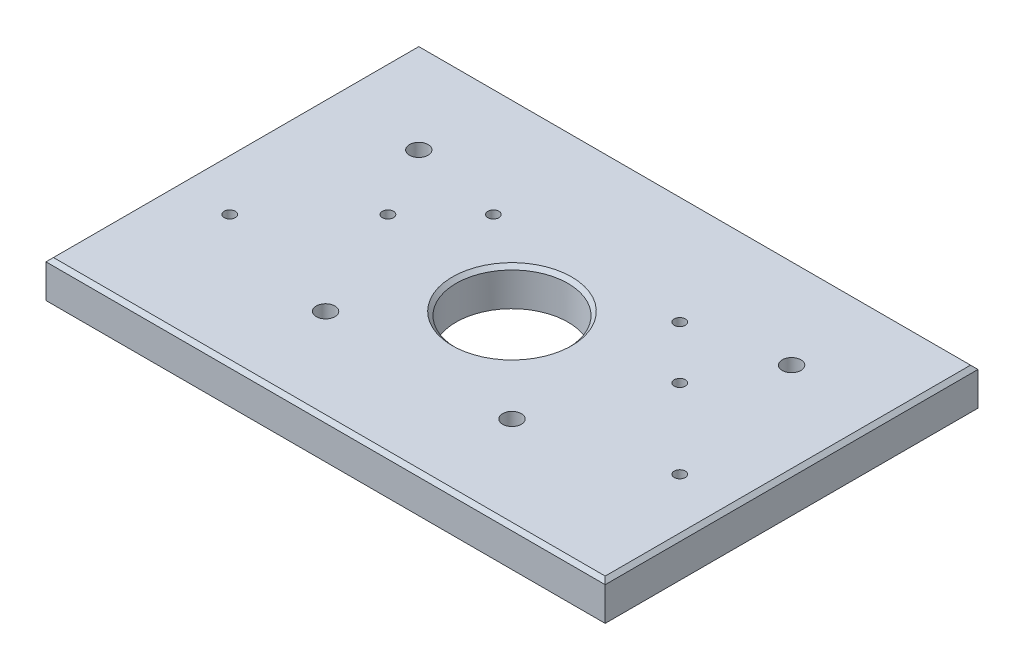
ISO-10303-21;
HEADER;
FILE_DESCRIPTION(('STEP AP214'),'2;1');
FILE_NAME('part.step','',(''),(''),'','','');
FILE_SCHEMA(('AUTOMOTIVE_DESIGN { 1 0 10303 214 1 1 1 1 }'));
ENDSEC;
DATA;
#1=APPLICATION_CONTEXT('core data for automotive mechanical design processes');
#2=APPLICATION_PROTOCOL_DEFINITION('international standard','automotive_design',2000,#1);
#3=PRODUCT_CONTEXT('',#1,'mechanical');
#4=PRODUCT('Part','Part','',(#3));
#5=PRODUCT_RELATED_PRODUCT_CATEGORY('part','',(#4));
#6=PRODUCT_DEFINITION_FORMATION('','',#4);
#7=PRODUCT_DEFINITION_CONTEXT('part definition',#1,'design');
#8=PRODUCT_DEFINITION('design','',#6,#7);
#9=PRODUCT_DEFINITION_SHAPE('','',#8);
#10=(LENGTH_UNIT() NAMED_UNIT(*) SI_UNIT(.MILLI.,.METRE.));
#11=(NAMED_UNIT(*) PLANE_ANGLE_UNIT() SI_UNIT($,.RADIAN.));
#12=(NAMED_UNIT(*) SI_UNIT($,.STERADIAN.) SOLID_ANGLE_UNIT());
#13=UNCERTAINTY_MEASURE_WITH_UNIT(LENGTH_MEASURE(1.E-05),#10,'distance_accuracy_value','');
#14=(GEOMETRIC_REPRESENTATION_CONTEXT(3) GLOBAL_UNCERTAINTY_ASSIGNED_CONTEXT((#13)) GLOBAL_UNIT_ASSIGNED_CONTEXT((#10,
#11,#12)) REPRESENTATION_CONTEXT('',''));
#15=CARTESIAN_POINT('',(0.,0.,0.));
#16=DIRECTION('',(0.,0.,1.));
#17=DIRECTION('',(1.,0.,0.));
#18=AXIS2_PLACEMENT_3D('',#15,#16,#17);
#19=CARTESIAN_POINT('',(0.,10.,0.));
#20=DIRECTION('',(0.,-1.,0.));
#21=DIRECTION('',(0.,0.,-1.));
#22=AXIS2_PLACEMENT_3D('',#19,#20,#21);
#23=PLANE('',#22);
#24=CARTESIAN_POINT('',(75.,10.,-50.));
#25=DIRECTION('',(0.,-1.,0.));
#26=DIRECTION('',(0.,0.,-1.));
#27=AXIS2_PLACEMENT_3D('',#24,#25,#26);
#28=CIRCLE('',#27,16.);
#29=CARTESIAN_POINT('',(75.,10.,-66.));
#30=VERTEX_POINT('',#29);
#31=EDGE_CURVE('E197',#30,#30,#28,.T.);
#32=ORIENTED_EDGE('',*,*,#31,.T.);
#33=EDGE_LOOP('',(#32));
#34=FACE_BOUND('',#33,.T.);
#35=DIRECTION('',(1.,0.,0.));
#36=VECTOR('',#35,1.);
#37=CARTESIAN_POINT('',(0.,10.,-1.));
#38=LINE('',#37,#36);
#39=CARTESIAN_POINT('',(1.,10.,-1.));
#40=VERTEX_POINT('',#39);
#41=CARTESIAN_POINT('',(149.,10.,-1.));
#42=VERTEX_POINT('',#41);
#43=EDGE_CURVE('E140',#40,#42,#38,.T.);
#44=ORIENTED_EDGE('',*,*,#43,.T.);
#45=DIRECTION('',(0.,0.,-1.));
#46=VECTOR('',#45,1.);
#47=CARTESIAN_POINT('',(149.,10.,0.));
#48=LINE('',#47,#46);
#49=CARTESIAN_POINT('',(149.,10.,-99.));
#50=VERTEX_POINT('',#49);
#51=EDGE_CURVE('E194',#42,#50,#48,.T.);
#52=ORIENTED_EDGE('',*,*,#51,.T.);
#53=DIRECTION('',(-1.,0.,0.));
#54=VECTOR('',#53,1.);
#55=CARTESIAN_POINT('',(0.,10.,-99.));
#56=LINE('',#55,#54);
#57=CARTESIAN_POINT('',(1.,10.,-99.));
#58=VERTEX_POINT('',#57);
#59=EDGE_CURVE('E147',#50,#58,#56,.T.);
#60=ORIENTED_EDGE('',*,*,#59,.T.);
#61=DIRECTION('',(0.,0.,1.));
#62=VECTOR('',#61,1.);
#63=CARTESIAN_POINT('',(1.,10.,0.));
#64=LINE('',#63,#62);
#65=EDGE_CURVE('E144',#58,#40,#64,.T.);
#66=ORIENTED_EDGE('',*,*,#65,.T.);
#67=EDGE_LOOP('',(#44,#52,#60,#66));
#68=FACE_BOUND('',#67,.T.);
#69=CARTESIAN_POINT('',(35.857864376269,10.,-55.8578643762691));
#70=DIRECTION('',(0.,1.,0.));
#71=DIRECTION('',(0.,0.,1.));
#72=AXIS2_PLACEMENT_3D('',#69,#70,#71);
#73=CIRCLE('',#72,1.50000000000001);
#74=CARTESIAN_POINT('',(35.857864376269,10.,-54.3578643762691));
#75=VERTEX_POINT('',#74);
#76=EDGE_CURVE('E508',#75,#75,#73,.T.);
#77=ORIENTED_EDGE('',*,*,#76,.F.);
#78=EDGE_LOOP('',(#77));
#79=FACE_BOUND('',#78,.T.);
#80=CARTESIAN_POINT('',(14.6446609406726,10.,-34.6446609406727));
#81=DIRECTION('',(0.,1.,0.));
#82=DIRECTION('',(0.,0.,1.));
#83=AXIS2_PLACEMENT_3D('',#80,#81,#82);
#84=CIRCLE('',#83,1.5);
#85=CARTESIAN_POINT('',(14.6446609406726,10.,-33.1446609406727));
#86=VERTEX_POINT('',#85);
#87=EDGE_CURVE('E518',#86,#86,#84,.T.);
#88=ORIENTED_EDGE('',*,*,#87,.F.);
#89=EDGE_LOOP('',(#88));
#90=FACE_BOUND('',#89,.T.);
#91=CARTESIAN_POINT('',(50.,10.,-25.));
#92=DIRECTION('',(0.,1.,0.));
#93=DIRECTION('',(0.,0.,1.));
#94=AXIS2_PLACEMENT_3D('',#91,#92,#93);
#95=CIRCLE('',#94,2.5);
#96=CARTESIAN_POINT('',(50.,10.,-22.5));
#97=VERTEX_POINT('',#96);
#98=EDGE_CURVE('E524',#97,#97,#95,.T.);
#99=ORIENTED_EDGE('',*,*,#98,.F.);
#100=EDGE_LOOP('',(#99));
#101=FACE_BOUND('',#100,.T.);
#102=CARTESIAN_POINT('',(50.,10.,-70.));
#103=DIRECTION('',(0.,1.,0.));
#104=DIRECTION('',(0.,0.,1.));
#105=AXIS2_PLACEMENT_3D('',#102,#103,#104);
#106=CIRCLE('',#105,1.5);
#107=CARTESIAN_POINT('',(50.,10.,-68.5));
#108=VERTEX_POINT('',#107);
#109=EDGE_CURVE('E509',#108,#108,#106,.T.);
#110=ORIENTED_EDGE('',*,*,#109,.F.);
#111=EDGE_LOOP('',(#110));
#112=FACE_BOUND('',#111,.T.);
#113=CARTESIAN_POINT('',(25.,10.,-75.));
#114=DIRECTION('',(0.,1.,0.));
#115=DIRECTION('',(0.,0.,1.));
#116=AXIS2_PLACEMENT_3D('',#113,#114,#115);
#117=CIRCLE('',#116,2.5);
#118=CARTESIAN_POINT('',(25.,10.,-72.5));
#119=VERTEX_POINT('',#118);
#120=EDGE_CURVE('E173',#119,#119,#117,.T.);
#121=ORIENTED_EDGE('',*,*,#120,.F.);
#122=EDGE_LOOP('',(#121));
#123=FACE_BOUND('',#122,.T.);
#124=CARTESIAN_POINT('',(100.,10.,-70.));
#125=DIRECTION('',(0.,-1.,0.));
#126=DIRECTION('',(0.,0.,-1.));
#127=AXIS2_PLACEMENT_3D('',#124,#125,#126);
#128=CIRCLE('',#127,1.5);
#129=CARTESIAN_POINT('',(100.,10.,-71.5));
#130=VERTEX_POINT('',#129);
#131=EDGE_CURVE('E121',#130,#130,#128,.T.);
#132=ORIENTED_EDGE('',*,*,#131,.T.);
#133=EDGE_LOOP('',(#132));
#134=FACE_BOUND('',#133,.T.);
#135=CARTESIAN_POINT('',(125.,10.,-75.));
#136=DIRECTION('',(0.,-1.,0.));
#137=DIRECTION('',(0.,0.,-1.));
#138=AXIS2_PLACEMENT_3D('',#135,#136,#137);
#139=CIRCLE('',#138,2.5);
#140=CARTESIAN_POINT('',(125.,10.,-77.5));
#141=VERTEX_POINT('',#140);
#142=EDGE_CURVE('E473',#141,#141,#139,.T.);
#143=ORIENTED_EDGE('',*,*,#142,.T.);
#144=EDGE_LOOP('',(#143));
#145=FACE_BOUND('',#144,.T.);
#146=CARTESIAN_POINT('',(114.142135623731,10.,-55.8578643762691));
#147=DIRECTION('',(0.,-1.,0.));
#148=DIRECTION('',(0.,0.,-1.));
#149=AXIS2_PLACEMENT_3D('',#146,#147,#148);
#150=CIRCLE('',#149,1.5);
#151=CARTESIAN_POINT('',(114.142135623731,10.,-57.3578643762691));
#152=VERTEX_POINT('',#151);
#153=EDGE_CURVE('E477',#152,#152,#150,.T.);
#154=ORIENTED_EDGE('',*,*,#153,.T.);
#155=EDGE_LOOP('',(#154));
#156=FACE_BOUND('',#155,.T.);
#157=CARTESIAN_POINT('',(135.355339059327,10.,-34.6446609406727));
#158=DIRECTION('',(0.,-1.,0.));
#159=DIRECTION('',(0.,0.,-1.));
#160=AXIS2_PLACEMENT_3D('',#157,#158,#159);
#161=CIRCLE('',#160,1.5);
#162=CARTESIAN_POINT('',(135.355339059327,10.,-36.1446609406727));
#163=VERTEX_POINT('',#162);
#164=EDGE_CURVE('E481',#163,#163,#161,.T.);
#165=ORIENTED_EDGE('',*,*,#164,.T.);
#166=EDGE_LOOP('',(#165));
#167=FACE_BOUND('',#166,.T.);
#168=CARTESIAN_POINT('',(100.,10.,-25.));
#169=DIRECTION('',(0.,-1.,0.));
#170=DIRECTION('',(0.,0.,-1.));
#171=AXIS2_PLACEMENT_3D('',#168,#169,#170);
#172=CIRCLE('',#171,2.5);
#173=CARTESIAN_POINT('',(100.,10.,-27.5));
#174=VERTEX_POINT('',#173);
#175=EDGE_CURVE('E183',#174,#174,#172,.T.);
#176=ORIENTED_EDGE('',*,*,#175,.T.);
#177=EDGE_LOOP('',(#176));
#178=FACE_BOUND('',#177,.T.);
#179=ADVANCED_FACE('F45',(#34,#68,#79,#90,#101,#112,#123,#134,#145,#156,#167,#178),#23,.F.);
#180=CARTESIAN_POINT('',(0.,0.,0.));
#181=DIRECTION('',(0.,-1.,0.));
#182=DIRECTION('',(0.,0.,-1.));
#183=AXIS2_PLACEMENT_3D('',#180,#181,#182);
#184=PLANE('',#183);
#185=CARTESIAN_POINT('',(35.857864376269,0.,-55.8578643762691));
#186=DIRECTION('',(0.,1.,0.));
#187=DIRECTION('',(0.,0.,1.));
#188=AXIS2_PLACEMENT_3D('',#185,#186,#187);
#189=CIRCLE('',#188,1.50000000000001);
#190=CARTESIAN_POINT('',(35.857864376269,0.,-54.3578643762691));
#191=VERTEX_POINT('',#190);
#192=EDGE_CURVE('E505',#191,#191,#189,.T.);
#193=ORIENTED_EDGE('',*,*,#192,.T.);
#194=EDGE_LOOP('',(#193));
#195=FACE_BOUND('',#194,.T.);
#196=CARTESIAN_POINT('',(14.6446609406726,0.,-34.6446609406727));
#197=DIRECTION('',(0.,1.,0.));
#198=DIRECTION('',(0.,0.,1.));
#199=AXIS2_PLACEMENT_3D('',#196,#197,#198);
#200=CIRCLE('',#199,1.5);
#201=CARTESIAN_POINT('',(14.6446609406726,0.,-33.1446609406727));
#202=VERTEX_POINT('',#201);
#203=EDGE_CURVE('E513',#202,#202,#200,.T.);
#204=ORIENTED_EDGE('',*,*,#203,.T.);
#205=EDGE_LOOP('',(#204));
#206=FACE_BOUND('',#205,.T.);
#207=CARTESIAN_POINT('',(50.,0.,-25.));
#208=DIRECTION('',(0.,1.,0.));
#209=DIRECTION('',(0.,0.,1.));
#210=AXIS2_PLACEMENT_3D('',#207,#208,#209);
#211=CIRCLE('',#210,2.5);
#212=CARTESIAN_POINT('',(50.,0.,-22.5));
#213=VERTEX_POINT('',#212);
#214=EDGE_CURVE('E522',#213,#213,#211,.T.);
#215=ORIENTED_EDGE('',*,*,#214,.T.);
#216=EDGE_LOOP('',(#215));
#217=FACE_BOUND('',#216,.T.);
#218=CARTESIAN_POINT('',(135.355339059327,0.,-34.6446609406727));
#219=DIRECTION('',(0.,-1.,0.));
#220=DIRECTION('',(0.,0.,-1.));
#221=AXIS2_PLACEMENT_3D('',#218,#219,#220);
#222=CIRCLE('',#221,1.5);
#223=CARTESIAN_POINT('',(135.355339059327,0.,-36.1446609406727));
#224=VERTEX_POINT('',#223);
#225=EDGE_CURVE('E187',#224,#224,#222,.T.);
#226=ORIENTED_EDGE('',*,*,#225,.F.);
#227=EDGE_LOOP('',(#226));
#228=FACE_BOUND('',#227,.T.);
#229=CARTESIAN_POINT('',(125.,0.,-75.));
#230=DIRECTION('',(0.,-1.,0.));
#231=DIRECTION('',(0.,0.,-1.));
#232=AXIS2_PLACEMENT_3D('',#229,#230,#231);
#233=CIRCLE('',#232,2.5);
#234=CARTESIAN_POINT('',(125.,0.,-77.5));
#235=VERTEX_POINT('',#234);
#236=EDGE_CURVE('E493',#235,#235,#233,.T.);
#237=ORIENTED_EDGE('',*,*,#236,.F.);
#238=EDGE_LOOP('',(#237));
#239=FACE_BOUND('',#238,.T.);
#240=DIRECTION('',(0.,0.,1.));
#241=VECTOR('',#240,1.);
#242=CARTESIAN_POINT('',(0.,0.,0.));
#243=LINE('',#242,#241);
#244=CARTESIAN_POINT('',(0.,0.,-100.));
#245=VERTEX_POINT('',#244);
#246=CARTESIAN_POINT('',(0.,0.,0.));
#247=VERTEX_POINT('',#246);
#248=EDGE_CURVE('E111',#245,#247,#243,.T.);
#249=ORIENTED_EDGE('',*,*,#248,.F.);
#250=DIRECTION('',(-1.,0.,0.));
#251=VECTOR('',#250,1.);
#252=CARTESIAN_POINT('',(0.,0.,-100.));
#253=LINE('',#252,#251);
#254=CARTESIAN_POINT('',(150.,0.,-100.));
#255=VERTEX_POINT('',#254);
#256=EDGE_CURVE('E126',#255,#245,#253,.T.);
#257=ORIENTED_EDGE('',*,*,#256,.F.);
#258=DIRECTION('',(0.,0.,-1.));
#259=VECTOR('',#258,1.);
#260=CARTESIAN_POINT('',(150.,0.,0.));
#261=LINE('',#260,#259);
#262=CARTESIAN_POINT('',(150.,0.,0.));
#263=VERTEX_POINT('',#262);
#264=EDGE_CURVE('E113',#263,#255,#261,.T.);
#265=ORIENTED_EDGE('',*,*,#264,.F.);
#266=DIRECTION('',(1.,0.,0.));
#267=VECTOR('',#266,1.);
#268=CARTESIAN_POINT('',(0.,0.,0.));
#269=LINE('',#268,#267);
#270=EDGE_CURVE('E100',#247,#263,#269,.T.);
#271=ORIENTED_EDGE('',*,*,#270,.F.);
#272=EDGE_LOOP('',(#249,#257,#265,#271));
#273=FACE_BOUND('',#272,.T.);
#274=CARTESIAN_POINT('',(75.,0.,-50.));
#275=DIRECTION('',(0.,1.,0.));
#276=DIRECTION('',(0.,0.,1.));
#277=AXIS2_PLACEMENT_3D('',#274,#275,#276);
#278=CIRCLE('',#277,15.);
#279=CARTESIAN_POINT('',(75.,0.,-35.));
#280=VERTEX_POINT('',#279);
#281=EDGE_CURVE('E118',#280,#280,#278,.T.);
#282=ORIENTED_EDGE('',*,*,#281,.T.);
#283=EDGE_LOOP('',(#282));
#284=FACE_BOUND('',#283,.T.);
#285=CARTESIAN_POINT('',(25.,0.,-75.));
#286=DIRECTION('',(0.,1.,0.));
#287=DIRECTION('',(0.,0.,1.));
#288=AXIS2_PLACEMENT_3D('',#285,#286,#287);
#289=CIRCLE('',#288,2.5);
#290=CARTESIAN_POINT('',(25.,0.,-72.5));
#291=VERTEX_POINT('',#290);
#292=EDGE_CURVE('E168',#291,#291,#289,.T.);
#293=ORIENTED_EDGE('',*,*,#292,.T.);
#294=EDGE_LOOP('',(#293));
#295=FACE_BOUND('',#294,.T.);
#296=CARTESIAN_POINT('',(50.,0.,-70.));
#297=DIRECTION('',(0.,1.,0.));
#298=DIRECTION('',(0.,0.,1.));
#299=AXIS2_PLACEMENT_3D('',#296,#297,#298);
#300=CIRCLE('',#299,1.5);
#301=CARTESIAN_POINT('',(50.,0.,-68.5));
#302=VERTEX_POINT('',#301);
#303=EDGE_CURVE('E178',#302,#302,#300,.T.);
#304=ORIENTED_EDGE('',*,*,#303,.T.);
#305=EDGE_LOOP('',(#304));
#306=FACE_BOUND('',#305,.T.);
#307=CARTESIAN_POINT('',(100.,0.,-70.));
#308=DIRECTION('',(0.,-1.,0.));
#309=DIRECTION('',(0.,0.,-1.));
#310=AXIS2_PLACEMENT_3D('',#307,#308,#309);
#311=CIRCLE('',#310,1.5);
#312=CARTESIAN_POINT('',(100.,0.,-71.5));
#313=VERTEX_POINT('',#312);
#314=EDGE_CURVE('E501',#313,#313,#311,.T.);
#315=ORIENTED_EDGE('',*,*,#314,.F.);
#316=EDGE_LOOP('',(#315));
#317=FACE_BOUND('',#316,.T.);
#318=CARTESIAN_POINT('',(114.142135623731,0.,-55.8578643762691));
#319=DIRECTION('',(0.,-1.,0.));
#320=DIRECTION('',(0.,0.,-1.));
#321=AXIS2_PLACEMENT_3D('',#318,#319,#320);
#322=CIRCLE('',#321,1.5);
#323=CARTESIAN_POINT('',(114.142135623731,0.,-57.3578643762691));
#324=VERTEX_POINT('',#323);
#325=EDGE_CURVE('E485',#324,#324,#322,.T.);
#326=ORIENTED_EDGE('',*,*,#325,.F.);
#327=EDGE_LOOP('',(#326));
#328=FACE_BOUND('',#327,.T.);
#329=CARTESIAN_POINT('',(100.,0.,-25.));
#330=DIRECTION('',(0.,-1.,0.));
#331=DIRECTION('',(0.,0.,-1.));
#332=AXIS2_PLACEMENT_3D('',#329,#330,#331);
#333=CIRCLE('',#332,2.5);
#334=CARTESIAN_POINT('',(100.,0.,-27.5));
#335=VERTEX_POINT('',#334);
#336=EDGE_CURVE('E188',#335,#335,#333,.T.);
#337=ORIENTED_EDGE('',*,*,#336,.F.);
#338=EDGE_LOOP('',(#337));
#339=FACE_BOUND('',#338,.T.);
#340=ADVANCED_FACE('F108',(#195,#206,#217,#228,#239,#273,#284,#295,#306,#317,#328,#339),#184,.T.);
#341=CARTESIAN_POINT('',(0.,10.,0.));
#342=DIRECTION('',(1.,0.,0.));
#343=DIRECTION('',(0.,0.,-1.));
#344=AXIS2_PLACEMENT_3D('',#341,#342,#343);
#345=PLANE('',#344);
#346=DIRECTION('',(0.,-1.,0.));
#347=VECTOR('',#346,1.);
#348=CARTESIAN_POINT('',(0.,10.,0.));
#349=LINE('',#348,#347);
#350=CARTESIAN_POINT('',(0.,9.,0.));
#351=VERTEX_POINT('',#350);
#352=EDGE_CURVE('E97',#351,#247,#349,.T.);
#353=ORIENTED_EDGE('',*,*,#352,.F.);
#354=DIRECTION('',(0.,0.,-1.));
#355=VECTOR('',#354,1.);
#356=CARTESIAN_POINT('',(0.,9.,0.));
#357=LINE('',#356,#355);
#358=CARTESIAN_POINT('',(0.,9.,-100.));
#359=VERTEX_POINT('',#358);
#360=EDGE_CURVE('E55',#351,#359,#357,.T.);
#361=ORIENTED_EDGE('',*,*,#360,.T.);
#362=DIRECTION('',(0.,-1.,0.));
#363=VECTOR('',#362,1.);
#364=CARTESIAN_POINT('',(0.,10.,-100.));
#365=LINE('',#364,#363);
#366=EDGE_CURVE('E116',#359,#245,#365,.T.);
#367=ORIENTED_EDGE('',*,*,#366,.T.);
#368=ORIENTED_EDGE('',*,*,#248,.T.);
#369=EDGE_LOOP('',(#353,#361,#367,#368));
#370=FACE_BOUND('',#369,.T.);
#371=ADVANCED_FACE('F115',(#370),#345,.F.);
#372=CARTESIAN_POINT('',(0.,10.,0.));
#373=DIRECTION('',(0.,0.,-1.));
#374=DIRECTION('',(-1.,0.,0.));
#375=AXIS2_PLACEMENT_3D('',#372,#373,#374);
#376=PLANE('',#375);
#377=DIRECTION('',(0.,-1.,0.));
#378=VECTOR('',#377,1.);
#379=CARTESIAN_POINT('',(150.,10.,0.));
#380=LINE('',#379,#378);
#381=CARTESIAN_POINT('',(150.,9.,0.));
#382=VERTEX_POINT('',#381);
#383=EDGE_CURVE('E104',#382,#263,#380,.T.);
#384=ORIENTED_EDGE('',*,*,#383,.F.);
#385=DIRECTION('',(-1.,0.,0.));
#386=VECTOR('',#385,1.);
#387=CARTESIAN_POINT('',(0.,9.,0.));
#388=LINE('',#387,#386);
#389=EDGE_CURVE('E12',#382,#351,#388,.T.);
#390=ORIENTED_EDGE('',*,*,#389,.T.);
#391=ORIENTED_EDGE('',*,*,#352,.T.);
#392=ORIENTED_EDGE('',*,*,#270,.T.);
#393=EDGE_LOOP('',(#384,#390,#391,#392));
#394=FACE_BOUND('',#393,.T.);
#395=ADVANCED_FACE('F99',(#394),#376,.F.);
#396=CARTESIAN_POINT('',(150.,10.,0.));
#397=DIRECTION('',(-1.,0.,0.));
#398=DIRECTION('',(0.,0.,1.));
#399=AXIS2_PLACEMENT_3D('',#396,#397,#398);
#400=PLANE('',#399);
#401=DIRECTION('',(0.,-1.,0.));
#402=VECTOR('',#401,1.);
#403=CARTESIAN_POINT('',(150.,10.,-100.));
#404=LINE('',#403,#402);
#405=CARTESIAN_POINT('',(150.,9.,-100.));
#406=VERTEX_POINT('',#405);
#407=EDGE_CURVE('E129',#406,#255,#404,.T.);
#408=ORIENTED_EDGE('',*,*,#407,.F.);
#409=DIRECTION('',(0.,0.,1.));
#410=VECTOR('',#409,1.);
#411=CARTESIAN_POINT('',(150.,9.,0.));
#412=LINE('',#411,#410);
#413=EDGE_CURVE('E202',#406,#382,#412,.T.);
#414=ORIENTED_EDGE('',*,*,#413,.T.);
#415=ORIENTED_EDGE('',*,*,#383,.T.);
#416=ORIENTED_EDGE('',*,*,#264,.T.);
#417=EDGE_LOOP('',(#408,#414,#415,#416));
#418=FACE_BOUND('',#417,.T.);
#419=ADVANCED_FACE('F211',(#418),#400,.F.);
#420=CARTESIAN_POINT('',(0.,10.,-100.));
#421=DIRECTION('',(0.,0.,1.));
#422=DIRECTION('',(1.,0.,0.));
#423=AXIS2_PLACEMENT_3D('',#420,#421,#422);
#424=PLANE('',#423);
#425=ORIENTED_EDGE('',*,*,#366,.F.);
#426=DIRECTION('',(1.,0.,0.));
#427=VECTOR('',#426,1.);
#428=CARTESIAN_POINT('',(0.,9.,-100.));
#429=LINE('',#428,#427);
#430=EDGE_CURVE('E204',#359,#406,#429,.T.);
#431=ORIENTED_EDGE('',*,*,#430,.T.);
#432=ORIENTED_EDGE('',*,*,#407,.T.);
#433=ORIENTED_EDGE('',*,*,#256,.T.);
#434=EDGE_LOOP('',(#425,#431,#432,#433));
#435=FACE_BOUND('',#434,.T.);
#436=ADVANCED_FACE('F207',(#435),#424,.F.);
#437=CARTESIAN_POINT('',(75.,0.,-50.));
#438=DIRECTION('',(0.,1.,0.));
#439=DIRECTION('',(0.,0.,1.));
#440=AXIS2_PLACEMENT_3D('',#437,#438,#439);
#441=CYLINDRICAL_SURFACE('',#440,15.);
#442=CARTESIAN_POINT('',(75.,9.00000000000001,-50.));
#443=DIRECTION('',(0.,-1.,0.));
#444=DIRECTION('',(0.,0.,-1.));
#445=AXIS2_PLACEMENT_3D('',#442,#443,#444);
#446=CIRCLE('',#445,15.);
#447=CARTESIAN_POINT('',(75.,9.00000000000001,-65.));
#448=VERTEX_POINT('',#447);
#449=EDGE_CURVE('E103',#448,#448,#446,.F.);
#450=ORIENTED_EDGE('',*,*,#449,.T.);
#451=EDGE_LOOP('',(#450));
#452=FACE_BOUND('',#451,.T.);
#453=ORIENTED_EDGE('',*,*,#281,.F.);
#454=EDGE_LOOP('',(#453));
#455=FACE_BOUND('',#454,.T.);
#456=ADVANCED_FACE('F238',(#452,#455),#441,.F.);
#457=CARTESIAN_POINT('',(25.,0.,-75.));
#458=DIRECTION('',(0.,1.,0.));
#459=DIRECTION('',(0.,0.,1.));
#460=AXIS2_PLACEMENT_3D('',#457,#458,#459);
#461=CYLINDRICAL_SURFACE('',#460,2.5);
#462=ORIENTED_EDGE('',*,*,#292,.F.);
#463=EDGE_LOOP('',(#462));
#464=FACE_BOUND('',#463,.T.);
#465=ORIENTED_EDGE('',*,*,#120,.T.);
#466=EDGE_LOOP('',(#465));
#467=FACE_BOUND('',#466,.T.);
#468=ADVANCED_FACE('F293',(#464,#467),#461,.F.);
#469=CARTESIAN_POINT('',(50.,0.,-70.));
#470=DIRECTION('',(0.,1.,0.));
#471=DIRECTION('',(0.,0.,1.));
#472=AXIS2_PLACEMENT_3D('',#469,#470,#471);
#473=CYLINDRICAL_SURFACE('',#472,1.5);
#474=ORIENTED_EDGE('',*,*,#303,.F.);
#475=EDGE_LOOP('',(#474));
#476=FACE_BOUND('',#475,.T.);
#477=ORIENTED_EDGE('',*,*,#109,.T.);
#478=EDGE_LOOP('',(#477));
#479=FACE_BOUND('',#478,.T.);
#480=ADVANCED_FACE('F418',(#476,#479),#473,.F.);
#481=CARTESIAN_POINT('',(100.,0.,-70.));
#482=DIRECTION('',(0.,1.,0.));
#483=DIRECTION('',(0.,0.,1.));
#484=AXIS2_PLACEMENT_3D('',#481,#482,#483);
#485=CYLINDRICAL_SURFACE('',#484,1.5);
#486=ORIENTED_EDGE('',*,*,#314,.T.);
#487=EDGE_LOOP('',(#486));
#488=FACE_BOUND('',#487,.T.);
#489=ORIENTED_EDGE('',*,*,#131,.F.);
#490=EDGE_LOOP('',(#489));
#491=FACE_BOUND('',#490,.T.);
#492=ADVANCED_FACE('F406',(#488,#491),#485,.F.);
#493=CARTESIAN_POINT('',(125.,0.,-75.));
#494=DIRECTION('',(0.,1.,0.));
#495=DIRECTION('',(0.,0.,1.));
#496=AXIS2_PLACEMENT_3D('',#493,#494,#495);
#497=CYLINDRICAL_SURFACE('',#496,2.5);
#498=ORIENTED_EDGE('',*,*,#236,.T.);
#499=EDGE_LOOP('',(#498));
#500=FACE_BOUND('',#499,.T.);
#501=ORIENTED_EDGE('',*,*,#142,.F.);
#502=EDGE_LOOP('',(#501));
#503=FACE_BOUND('',#502,.T.);
#504=ADVANCED_FACE('F394',(#500,#503),#497,.F.);
#505=CARTESIAN_POINT('',(114.142135623731,0.,-55.8578643762691));
#506=DIRECTION('',(0.,1.,0.));
#507=DIRECTION('',(0.,0.,1.));
#508=AXIS2_PLACEMENT_3D('',#505,#506,#507);
#509=CYLINDRICAL_SURFACE('',#508,1.5);
#510=ORIENTED_EDGE('',*,*,#325,.T.);
#511=EDGE_LOOP('',(#510));
#512=FACE_BOUND('',#511,.T.);
#513=ORIENTED_EDGE('',*,*,#153,.F.);
#514=EDGE_LOOP('',(#513));
#515=FACE_BOUND('',#514,.T.);
#516=ADVANCED_FACE('F383',(#512,#515),#509,.F.);
#517=CARTESIAN_POINT('',(135.355339059327,0.,-34.6446609406727));
#518=DIRECTION('',(0.,1.,0.));
#519=DIRECTION('',(0.,0.,1.));
#520=AXIS2_PLACEMENT_3D('',#517,#518,#519);
#521=CYLINDRICAL_SURFACE('',#520,1.5);
#522=ORIENTED_EDGE('',*,*,#225,.T.);
#523=EDGE_LOOP('',(#522));
#524=FACE_BOUND('',#523,.T.);
#525=ORIENTED_EDGE('',*,*,#164,.F.);
#526=EDGE_LOOP('',(#525));
#527=FACE_BOUND('',#526,.T.);
#528=ADVANCED_FACE('F371',(#524,#527),#521,.F.);
#529=CARTESIAN_POINT('',(100.,0.,-25.));
#530=DIRECTION('',(0.,1.,0.));
#531=DIRECTION('',(0.,0.,1.));
#532=AXIS2_PLACEMENT_3D('',#529,#530,#531);
#533=CYLINDRICAL_SURFACE('',#532,2.5);
#534=ORIENTED_EDGE('',*,*,#336,.T.);
#535=EDGE_LOOP('',(#534));
#536=FACE_BOUND('',#535,.T.);
#537=ORIENTED_EDGE('',*,*,#175,.F.);
#538=EDGE_LOOP('',(#537));
#539=FACE_BOUND('',#538,.T.);
#540=ADVANCED_FACE('F359',(#536,#539),#533,.F.);
#541=CARTESIAN_POINT('',(50.,0.,-25.));
#542=DIRECTION('',(0.,1.,0.));
#543=DIRECTION('',(0.,0.,1.));
#544=AXIS2_PLACEMENT_3D('',#541,#542,#543);
#545=CYLINDRICAL_SURFACE('',#544,2.5);
#546=ORIENTED_EDGE('',*,*,#214,.F.);
#547=EDGE_LOOP('',(#546));
#548=FACE_BOUND('',#547,.T.);
#549=ORIENTED_EDGE('',*,*,#98,.T.);
#550=EDGE_LOOP('',(#549));
#551=FACE_BOUND('',#550,.T.);
#552=ADVANCED_FACE('F347',(#548,#551),#545,.F.);
#553=CARTESIAN_POINT('',(14.6446609406726,0.,-34.6446609406727));
#554=DIRECTION('',(0.,1.,0.));
#555=DIRECTION('',(0.,0.,1.));
#556=AXIS2_PLACEMENT_3D('',#553,#554,#555);
#557=CYLINDRICAL_SURFACE('',#556,1.5);
#558=ORIENTED_EDGE('',*,*,#203,.F.);
#559=EDGE_LOOP('',(#558));
#560=FACE_BOUND('',#559,.T.);
#561=ORIENTED_EDGE('',*,*,#87,.T.);
#562=EDGE_LOOP('',(#561));
#563=FACE_BOUND('',#562,.T.);
#564=ADVANCED_FACE('F335',(#560,#563),#557,.F.);
#565=CARTESIAN_POINT('',(35.857864376269,0.,-55.8578643762691));
#566=DIRECTION('',(0.,1.,0.));
#567=DIRECTION('',(0.,0.,1.));
#568=AXIS2_PLACEMENT_3D('',#565,#566,#567);
#569=CYLINDRICAL_SURFACE('',#568,1.50000000000001);
#570=ORIENTED_EDGE('',*,*,#192,.F.);
#571=EDGE_LOOP('',(#570));
#572=FACE_BOUND('',#571,.T.);
#573=ORIENTED_EDGE('',*,*,#76,.T.);
#574=EDGE_LOOP('',(#573));
#575=FACE_BOUND('',#574,.T.);
#576=ADVANCED_FACE('F251',(#572,#575),#569,.F.);
#577=CARTESIAN_POINT('',(75.,9.00000000000001,-50.));
#578=DIRECTION('',(0.,1.,0.));
#579=DIRECTION('',(0.,0.,1.));
#580=AXIS2_PLACEMENT_3D('',#577,#578,#579);
#581=CONICAL_SURFACE('',#580,15.,0.785398163397439);
#582=ORIENTED_EDGE('',*,*,#31,.F.);
#583=EDGE_LOOP('',(#582));
#584=FACE_BOUND('',#583,.T.);
#585=ORIENTED_EDGE('',*,*,#449,.F.);
#586=EDGE_LOOP('',(#585));
#587=FACE_BOUND('',#586,.T.);
#588=ADVANCED_FACE('F227',(#584,#587),#581,.F.);
#589=CARTESIAN_POINT('',(1.,10.,0.));
#590=DIRECTION('',(0.707106781186547,-0.707106781186547,0.));
#591=DIRECTION('',(0.,0.,1.));
#592=AXIS2_PLACEMENT_3D('',#589,#590,#591);
#593=PLANE('',#592);
#594=DIRECTION('',(-0.577350269189626,-0.577350269189626,-0.577350269189626));
#595=VECTOR('',#594,1.);
#596=CARTESIAN_POINT('',(34.,43.,-66.));
#597=LINE('',#596,#595);
#598=EDGE_CURVE('E161',#359,#58,#597,.F.);
#599=ORIENTED_EDGE('',*,*,#598,.F.);
#600=ORIENTED_EDGE('',*,*,#360,.F.);
#601=DIRECTION('',(-0.577350269189626,-0.577350269189626,0.577350269189626));
#602=VECTOR('',#601,1.);
#603=CARTESIAN_POINT('',(0.666666666666667,9.66666666666667,-0.666666666666667));
#604=LINE('',#603,#602);
#605=EDGE_CURVE('E49',#40,#351,#604,.T.);
#606=ORIENTED_EDGE('',*,*,#605,.F.);
#607=ORIENTED_EDGE('',*,*,#65,.F.);
#608=EDGE_LOOP('',(#599,#600,#606,#607));
#609=FACE_BOUND('',#608,.T.);
#610=ADVANCED_FACE('F47',(#609),#593,.F.);
#611=CARTESIAN_POINT('',(0.,10.,-1.));
#612=DIRECTION('',(0.,-0.707106781186547,-0.707106781186547));
#613=DIRECTION('',(1.,0.,0.));
#614=AXIS2_PLACEMENT_3D('',#611,#612,#613);
#615=PLANE('',#614);
#616=ORIENTED_EDGE('',*,*,#605,.T.);
#617=ORIENTED_EDGE('',*,*,#389,.F.);
#618=DIRECTION('',(-0.577350269189626,0.577350269189626,-0.577350269189626));
#619=VECTOR('',#618,1.);
#620=CARTESIAN_POINT('',(99.3333333333333,59.6666666666667,-50.6666666666667));
#621=LINE('',#620,#619);
#622=EDGE_CURVE('E160',#42,#382,#621,.F.);
#623=ORIENTED_EDGE('',*,*,#622,.F.);
#624=ORIENTED_EDGE('',*,*,#43,.F.);
#625=EDGE_LOOP('',(#616,#617,#623,#624));
#626=FACE_BOUND('',#625,.T.);
#627=ADVANCED_FACE('F220',(#626),#615,.F.);
#628=CARTESIAN_POINT('',(0.,10.,-99.));
#629=DIRECTION('',(0.,-0.707106781186547,0.707106781186547));
#630=DIRECTION('',(-1.,0.,0.));
#631=AXIS2_PLACEMENT_3D('',#628,#629,#630);
#632=PLANE('',#631);
#633=ORIENTED_EDGE('',*,*,#598,.T.);
#634=ORIENTED_EDGE('',*,*,#59,.F.);
#635=DIRECTION('',(0.577350269189626,-0.577350269189626,-0.577350269189626));
#636=VECTOR('',#635,1.);
#637=CARTESIAN_POINT('',(99.3333333333333,59.6666666666667,-49.3333333333333));
#638=LINE('',#637,#636);
#639=EDGE_CURVE('E158',#406,#50,#638,.F.);
#640=ORIENTED_EDGE('',*,*,#639,.F.);
#641=ORIENTED_EDGE('',*,*,#430,.F.);
#642=EDGE_LOOP('',(#633,#634,#640,#641));
#643=FACE_BOUND('',#642,.T.);
#644=ADVANCED_FACE('F216',(#643),#632,.F.);
#645=CARTESIAN_POINT('',(149.,10.,0.));
#646=DIRECTION('',(-0.707106781186547,-0.707106781186547,0.));
#647=DIRECTION('',(0.,0.,-1.));
#648=AXIS2_PLACEMENT_3D('',#645,#646,#647);
#649=PLANE('',#648);
#650=ORIENTED_EDGE('',*,*,#622,.T.);
#651=ORIENTED_EDGE('',*,*,#413,.F.);
#652=ORIENTED_EDGE('',*,*,#639,.T.);
#653=ORIENTED_EDGE('',*,*,#51,.F.);
#654=EDGE_LOOP('',(#650,#651,#652,#653));
#655=FACE_BOUND('',#654,.T.);
#656=ADVANCED_FACE('F213',(#655),#649,.F.);
#657=CLOSED_SHELL('',(#179,#340,#371,#395,#419,#436,#456,#468,#480,#492,#504,#516,#528,#540,
#552,#564,#576,#588,#610,#627,#644,#656));
#658=MANIFOLD_SOLID_BREP('B2',#657);
#659=ADVANCED_BREP_SHAPE_REPRESENTATION('',(#18,#658),#14);
#660=SHAPE_DEFINITION_REPRESENTATION(#9,#659);
ENDSEC;
END-ISO-10303-21;
